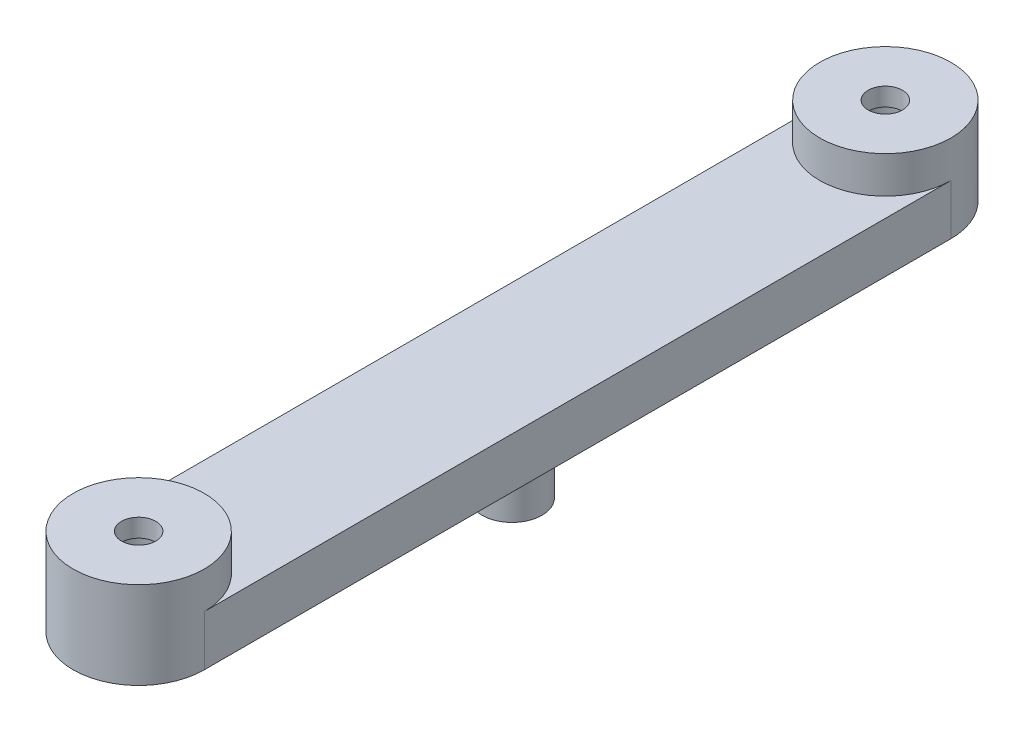
ISO-10303-21;
HEADER;
FILE_DESCRIPTION(('STEP AP214'),'2;1');
FILE_NAME('part.step','',(''),(''),'','','');
FILE_SCHEMA(('AUTOMOTIVE_DESIGN { 1 0 10303 214 1 1 1 1 }'));
ENDSEC;
DATA;
#1=APPLICATION_CONTEXT('core data for automotive mechanical design processes');
#2=APPLICATION_PROTOCOL_DEFINITION('international standard','automotive_design',2000,#1);
#3=PRODUCT_CONTEXT('',#1,'mechanical');
#4=PRODUCT('Part','Part','',(#3));
#5=PRODUCT_RELATED_PRODUCT_CATEGORY('part','',(#4));
#6=PRODUCT_DEFINITION_FORMATION('','',#4);
#7=PRODUCT_DEFINITION_CONTEXT('part definition',#1,'design');
#8=PRODUCT_DEFINITION('design','',#6,#7);
#9=PRODUCT_DEFINITION_SHAPE('','',#8);
#10=(LENGTH_UNIT() NAMED_UNIT(*) SI_UNIT(.MILLI.,.METRE.));
#11=(NAMED_UNIT(*) PLANE_ANGLE_UNIT() SI_UNIT($,.RADIAN.));
#12=(NAMED_UNIT(*) SI_UNIT($,.STERADIAN.) SOLID_ANGLE_UNIT());
#13=UNCERTAINTY_MEASURE_WITH_UNIT(LENGTH_MEASURE(1.E-05),#10,'distance_accuracy_value','');
#14=(GEOMETRIC_REPRESENTATION_CONTEXT(3) GLOBAL_UNCERTAINTY_ASSIGNED_CONTEXT((#13)) GLOBAL_UNIT_ASSIGNED_CONTEXT((#10,
#11,#12)) REPRESENTATION_CONTEXT('',''));
#15=CARTESIAN_POINT('',(0.,0.,0.));
#16=DIRECTION('',(0.,0.,1.));
#17=DIRECTION('',(1.,0.,0.));
#18=AXIS2_PLACEMENT_3D('',#15,#16,#17);
#19=CARTESIAN_POINT('',(6.5,-39.75,207.));
#20=DIRECTION('',(-1.,0.,0.));
#21=DIRECTION('',(0.,0.,1.));
#22=AXIS2_PLACEMENT_3D('',#19,#20,#21);
#23=PLANE('',#22);
#24=DIRECTION('',(0.,0.,-1.));
#25=VECTOR('',#24,1.);
#26=CARTESIAN_POINT('',(6.5,-44.75,207.));
#27=LINE('',#26,#25);
#28=CARTESIAN_POINT('',(6.5,-44.75,207.));
#29=VERTEX_POINT('',#28);
#30=CARTESIAN_POINT('',(6.5,-44.75,133.));
#31=VERTEX_POINT('',#30);
#32=EDGE_CURVE('E90',#29,#31,#27,.T.);
#33=ORIENTED_EDGE('',*,*,#32,.T.);
#34=DIRECTION('',(0.,-1.,0.));
#35=VECTOR('',#34,1.);
#36=CARTESIAN_POINT('',(6.5,-39.75,133.));
#37=LINE('',#36,#35);
#38=CARTESIAN_POINT('',(6.5,-39.75,133.));
#39=VERTEX_POINT('',#38);
#40=EDGE_CURVE('E11',#39,#31,#37,.T.);
#41=ORIENTED_EDGE('',*,*,#40,.F.);
#42=DIRECTION('',(0.,0.,-1.));
#43=VECTOR('',#42,1.);
#44=CARTESIAN_POINT('',(6.5,-39.75,207.));
#45=LINE('',#44,#43);
#46=CARTESIAN_POINT('',(6.5,-39.75,207.));
#47=VERTEX_POINT('',#46);
#48=EDGE_CURVE('E88',#47,#39,#45,.T.);
#49=ORIENTED_EDGE('',*,*,#48,.F.);
#50=DIRECTION('',(0.,-1.,0.));
#51=VECTOR('',#50,1.);
#52=CARTESIAN_POINT('',(6.5,-39.75,207.));
#53=LINE('',#52,#51);
#54=EDGE_CURVE('E83',#47,#29,#53,.T.);
#55=ORIENTED_EDGE('',*,*,#54,.T.);
#56=EDGE_LOOP('',(#33,#41,#49,#55));
#57=FACE_BOUND('',#56,.T.);
#58=ADVANCED_FACE('F43',(#57),#23,.F.);
#59=CARTESIAN_POINT('',(-6.5,-39.75,207.));
#60=DIRECTION('',(1.,0.,0.));
#61=DIRECTION('',(0.,0.,-1.));
#62=AXIS2_PLACEMENT_3D('',#59,#60,#61);
#63=PLANE('',#62);
#64=DIRECTION('',(0.,0.,1.));
#65=VECTOR('',#64,1.);
#66=CARTESIAN_POINT('',(-6.5,-44.75,207.));
#67=LINE('',#66,#65);
#68=CARTESIAN_POINT('',(-6.5,-44.75,133.));
#69=VERTEX_POINT('',#68);
#70=CARTESIAN_POINT('',(-6.5,-44.75,207.));
#71=VERTEX_POINT('',#70);
#72=EDGE_CURVE('E79',#69,#71,#67,.T.);
#73=ORIENTED_EDGE('',*,*,#72,.T.);
#74=DIRECTION('',(0.,-1.,0.));
#75=VECTOR('',#74,1.);
#76=CARTESIAN_POINT('',(-6.5,-39.75,207.));
#77=LINE('',#76,#75);
#78=CARTESIAN_POINT('',(-6.5,-39.75,207.));
#79=VERTEX_POINT('',#78);
#80=EDGE_CURVE('E95',#79,#71,#77,.T.);
#81=ORIENTED_EDGE('',*,*,#80,.F.);
#82=DIRECTION('',(0.,0.,1.));
#83=VECTOR('',#82,1.);
#84=CARTESIAN_POINT('',(-6.5,-39.75,207.));
#85=LINE('',#84,#83);
#86=CARTESIAN_POINT('',(-6.5,-39.75,133.));
#87=VERTEX_POINT('',#86);
#88=EDGE_CURVE('E93',#87,#79,#85,.T.);
#89=ORIENTED_EDGE('',*,*,#88,.F.);
#90=DIRECTION('',(0.,-1.,0.));
#91=VECTOR('',#90,1.);
#92=CARTESIAN_POINT('',(-6.5,-39.75,133.));
#93=LINE('',#92,#91);
#94=EDGE_CURVE('E52',#87,#69,#93,.T.);
#95=ORIENTED_EDGE('',*,*,#94,.T.);
#96=EDGE_LOOP('',(#73,#81,#89,#95));
#97=FACE_BOUND('',#96,.T.);
#98=ADVANCED_FACE('F190',(#97),#63,.F.);
#99=CARTESIAN_POINT('',(0.,-39.75,0.));
#100=DIRECTION('',(0.,-1.,0.));
#101=DIRECTION('',(0.,0.,-1.));
#102=AXIS2_PLACEMENT_3D('',#99,#100,#101);
#103=PLANE('',#102);
#104=CARTESIAN_POINT('',(0.,-39.75,133.));
#105=DIRECTION('',(0.,-1.,0.));
#106=DIRECTION('',(0.,0.,-1.));
#107=AXIS2_PLACEMENT_3D('',#104,#105,#106);
#108=CIRCLE('',#107,6.5);
#109=EDGE_CURVE('E101',#87,#39,#108,.F.);
#110=ORIENTED_EDGE('',*,*,#109,.F.);
#111=ORIENTED_EDGE('',*,*,#88,.T.);
#112=CARTESIAN_POINT('',(0.,-39.75,207.));
#113=DIRECTION('',(0.,-1.,0.));
#114=DIRECTION('',(0.,0.,-1.));
#115=AXIS2_PLACEMENT_3D('',#112,#113,#114);
#116=CIRCLE('',#115,6.5);
#117=EDGE_CURVE('E65',#47,#79,#116,.F.);
#118=ORIENTED_EDGE('',*,*,#117,.F.);
#119=ORIENTED_EDGE('',*,*,#48,.T.);
#120=EDGE_LOOP('',(#110,#111,#118,#119));
#121=FACE_BOUND('',#120,.T.);
#122=ADVANCED_FACE('F187',(#121),#103,.F.);
#123=CARTESIAN_POINT('',(0.,-44.75,0.));
#124=DIRECTION('',(0.,-1.,0.));
#125=DIRECTION('',(0.,0.,-1.));
#126=AXIS2_PLACEMENT_3D('',#123,#124,#125);
#127=PLANE('',#126);
#128=CARTESIAN_POINT('',(0.,-44.75,133.));
#129=DIRECTION('',(0.,1.,0.));
#130=DIRECTION('',(0.,0.,1.));
#131=AXIS2_PLACEMENT_3D('',#128,#129,#130);
#132=CIRCLE('',#131,3.);
#133=CARTESIAN_POINT('',(0.,-44.75,130.));
#134=VERTEX_POINT('',#133);
#135=EDGE_CURVE('E144',#134,#134,#132,.T.);
#136=ORIENTED_EDGE('',*,*,#135,.T.);
#137=EDGE_LOOP('',(#136));
#138=FACE_BOUND('',#137,.T.);
#139=CARTESIAN_POINT('',(0.,-44.75,207.));
#140=DIRECTION('',(0.,1.,0.));
#141=DIRECTION('',(0.,0.,1.));
#142=AXIS2_PLACEMENT_3D('',#139,#140,#141);
#143=CIRCLE('',#142,3.);
#144=CARTESIAN_POINT('',(0.,-44.75,204.));
#145=VERTEX_POINT('',#144);
#146=EDGE_CURVE('E149',#145,#145,#143,.T.);
#147=ORIENTED_EDGE('',*,*,#146,.T.);
#148=EDGE_LOOP('',(#147));
#149=FACE_BOUND('',#148,.T.);
#150=CARTESIAN_POINT('',(0.,-44.75,170.));
#151=DIRECTION('',(0.,1.,0.));
#152=DIRECTION('',(0.,0.,1.));
#153=AXIS2_PLACEMENT_3D('',#150,#151,#152);
#154=CIRCLE('',#153,2.975);
#155=CARTESIAN_POINT('',(0.,-44.75,172.975));
#156=VERTEX_POINT('',#155);
#157=EDGE_CURVE('E116',#156,#156,#154,.T.);
#158=ORIENTED_EDGE('',*,*,#157,.T.);
#159=EDGE_LOOP('',(#158));
#160=FACE_BOUND('',#159,.T.);
#161=ORIENTED_EDGE('',*,*,#72,.F.);
#162=CARTESIAN_POINT('',(0.,-44.75,133.));
#163=DIRECTION('',(0.,1.,0.));
#164=DIRECTION('',(0.,0.,1.));
#165=AXIS2_PLACEMENT_3D('',#162,#163,#164);
#166=CIRCLE('',#165,6.5);
#167=EDGE_CURVE('E103',#31,#69,#166,.T.);
#168=ORIENTED_EDGE('',*,*,#167,.F.);
#169=ORIENTED_EDGE('',*,*,#32,.F.);
#170=CARTESIAN_POINT('',(0.,-44.75,207.));
#171=DIRECTION('',(0.,1.,0.));
#172=DIRECTION('',(0.,0.,1.));
#173=AXIS2_PLACEMENT_3D('',#170,#171,#172);
#174=CIRCLE('',#173,6.5);
#175=EDGE_CURVE('E100',#71,#29,#174,.T.);
#176=ORIENTED_EDGE('',*,*,#175,.F.);
#177=EDGE_LOOP('',(#161,#168,#169,#176));
#178=FACE_BOUND('',#177,.T.);
#179=ADVANCED_FACE('F96',(#138,#149,#160,#178),#127,.T.);
#180=CARTESIAN_POINT('',(0.,-36.1,207.));
#181=DIRECTION('',(0.,-1.,0.));
#182=DIRECTION('',(0.,0.,-1.));
#183=AXIS2_PLACEMENT_3D('',#180,#181,#182);
#184=CYLINDRICAL_SURFACE('',#183,6.5);
#185=CARTESIAN_POINT('',(0.,-36.1,207.));
#186=DIRECTION('',(0.,1.,0.));
#187=DIRECTION('',(0.,0.,1.));
#188=AXIS2_PLACEMENT_3D('',#185,#186,#187);
#189=CIRCLE('',#188,6.5);
#190=CARTESIAN_POINT('',(0.,-36.1,213.5));
#191=VERTEX_POINT('',#190);
#192=EDGE_CURVE('E110',#191,#191,#189,.T.);
#193=ORIENTED_EDGE('',*,*,#192,.F.);
#194=EDGE_LOOP('',(#193));
#195=FACE_BOUND('',#194,.T.);
#196=ORIENTED_EDGE('',*,*,#175,.T.);
#197=ORIENTED_EDGE('',*,*,#54,.F.);
#198=ORIENTED_EDGE('',*,*,#117,.T.);
#199=ORIENTED_EDGE('',*,*,#80,.T.);
#200=EDGE_LOOP('',(#196,#197,#198,#199));
#201=FACE_BOUND('',#200,.T.);
#202=ADVANCED_FACE('F102',(#195,#201),#184,.T.);
#203=CARTESIAN_POINT('',(0.,-36.1,207.));
#204=DIRECTION('',(0.,1.,0.));
#205=DIRECTION('',(0.,0.,1.));
#206=AXIS2_PLACEMENT_3D('',#203,#204,#205);
#207=PLANE('',#206);
#208=CARTESIAN_POINT('',(0.,-36.1,207.));
#209=DIRECTION('',(0.,1.,0.));
#210=DIRECTION('',(0.,0.,1.));
#211=AXIS2_PLACEMENT_3D('',#208,#209,#210);
#212=CIRCLE('',#211,1.7);
#213=CARTESIAN_POINT('',(0.,-36.1,208.7));
#214=VERTEX_POINT('',#213);
#215=EDGE_CURVE('E142',#214,#214,#212,.T.);
#216=ORIENTED_EDGE('',*,*,#215,.F.);
#217=EDGE_LOOP('',(#216));
#218=FACE_BOUND('',#217,.T.);
#219=ORIENTED_EDGE('',*,*,#192,.T.);
#220=EDGE_LOOP('',(#219));
#221=FACE_BOUND('',#220,.T.);
#222=ADVANCED_FACE('F181',(#218,#221),#207,.T.);
#223=CARTESIAN_POINT('',(0.,-36.1,133.));
#224=DIRECTION('',(0.,-1.,0.));
#225=DIRECTION('',(0.,0.,-1.));
#226=AXIS2_PLACEMENT_3D('',#223,#224,#225);
#227=CYLINDRICAL_SURFACE('',#226,6.5);
#228=CARTESIAN_POINT('',(0.,-36.1,133.));
#229=DIRECTION('',(0.,1.,0.));
#230=DIRECTION('',(0.,0.,1.));
#231=AXIS2_PLACEMENT_3D('',#228,#229,#230);
#232=CIRCLE('',#231,6.5);
#233=CARTESIAN_POINT('',(0.,-36.1,139.5));
#234=VERTEX_POINT('',#233);
#235=EDGE_CURVE('E115',#234,#234,#232,.T.);
#236=ORIENTED_EDGE('',*,*,#235,.F.);
#237=EDGE_LOOP('',(#236));
#238=FACE_BOUND('',#237,.T.);
#239=ORIENTED_EDGE('',*,*,#109,.T.);
#240=ORIENTED_EDGE('',*,*,#40,.T.);
#241=ORIENTED_EDGE('',*,*,#167,.T.);
#242=ORIENTED_EDGE('',*,*,#94,.F.);
#243=EDGE_LOOP('',(#239,#240,#241,#242));
#244=FACE_BOUND('',#243,.T.);
#245=ADVANCED_FACE('F178',(#238,#244),#227,.T.);
#246=CARTESIAN_POINT('',(0.,-36.1,133.));
#247=DIRECTION('',(0.,1.,0.));
#248=DIRECTION('',(0.,0.,1.));
#249=AXIS2_PLACEMENT_3D('',#246,#247,#248);
#250=PLANE('',#249);
#251=CARTESIAN_POINT('',(0.,-36.1,133.));
#252=DIRECTION('',(0.,1.,0.));
#253=DIRECTION('',(0.,0.,1.));
#254=AXIS2_PLACEMENT_3D('',#251,#252,#253);
#255=CIRCLE('',#254,1.7);
#256=CARTESIAN_POINT('',(0.,-36.1,134.7));
#257=VERTEX_POINT('',#256);
#258=EDGE_CURVE('E159',#257,#257,#255,.T.);
#259=ORIENTED_EDGE('',*,*,#258,.F.);
#260=EDGE_LOOP('',(#259));
#261=FACE_BOUND('',#260,.T.);
#262=ORIENTED_EDGE('',*,*,#235,.T.);
#263=EDGE_LOOP('',(#262));
#264=FACE_BOUND('',#263,.T.);
#265=ADVANCED_FACE('F176',(#261,#264),#250,.T.);
#266=CARTESIAN_POINT('',(0.,-44.75,170.));
#267=DIRECTION('',(0.,-1.,0.));
#268=DIRECTION('',(0.,0.,-1.));
#269=AXIS2_PLACEMENT_3D('',#266,#267,#268);
#270=CYLINDRICAL_SURFACE('',#269,2.975);
#271=ORIENTED_EDGE('',*,*,#157,.F.);
#272=EDGE_LOOP('',(#271));
#273=FACE_BOUND('',#272,.T.);
#274=CARTESIAN_POINT('',(0.,-51.75,170.));
#275=DIRECTION('',(0.,1.,0.));
#276=DIRECTION('',(0.,0.,1.));
#277=AXIS2_PLACEMENT_3D('',#274,#275,#276);
#278=CIRCLE('',#277,2.975);
#279=CARTESIAN_POINT('',(0.,-51.75,172.975));
#280=VERTEX_POINT('',#279);
#281=EDGE_CURVE('E165',#280,#280,#278,.T.);
#282=ORIENTED_EDGE('',*,*,#281,.T.);
#283=EDGE_LOOP('',(#282));
#284=FACE_BOUND('',#283,.T.);
#285=ADVANCED_FACE('F207',(#273,#284),#270,.T.);
#286=CARTESIAN_POINT('',(0.,-51.75,170.));
#287=DIRECTION('',(0.,1.,0.));
#288=DIRECTION('',(0.,0.,1.));
#289=AXIS2_PLACEMENT_3D('',#286,#287,#288);
#290=PLANE('',#289);
#291=ORIENTED_EDGE('',*,*,#281,.F.);
#292=EDGE_LOOP('',(#291));
#293=FACE_BOUND('',#292,.T.);
#294=ADVANCED_FACE('F208',(#293),#290,.F.);
#295=CARTESIAN_POINT('',(0.,-36.1,133.));
#296=DIRECTION('',(0.,-1.,0.));
#297=DIRECTION('',(0.,0.,-1.));
#298=AXIS2_PLACEMENT_3D('',#295,#296,#297);
#299=CYLINDRICAL_SURFACE('',#298,1.7);
#300=CARTESIAN_POINT('',(0.,-37.9,133.));
#301=DIRECTION('',(0.,1.,0.));
#302=DIRECTION('',(0.,0.,1.));
#303=AXIS2_PLACEMENT_3D('',#300,#301,#302);
#304=CIRCLE('',#303,1.7);
#305=CARTESIAN_POINT('',(0.,-37.9,134.7));
#306=VERTEX_POINT('',#305);
#307=EDGE_CURVE('E46',#306,#306,#304,.T.);
#308=ORIENTED_EDGE('',*,*,#307,.F.);
#309=EDGE_LOOP('',(#308));
#310=FACE_BOUND('',#309,.T.);
#311=ORIENTED_EDGE('',*,*,#258,.T.);
#312=EDGE_LOOP('',(#311));
#313=FACE_BOUND('',#312,.T.);
#314=ADVANCED_FACE('F213',(#310,#313),#299,.F.);
#315=CARTESIAN_POINT('',(0.,-36.1,207.));
#316=DIRECTION('',(0.,-1.,0.));
#317=DIRECTION('',(0.,0.,-1.));
#318=AXIS2_PLACEMENT_3D('',#315,#316,#317);
#319=CYLINDRICAL_SURFACE('',#318,1.7);
#320=CARTESIAN_POINT('',(0.,-37.9,207.));
#321=DIRECTION('',(0.,1.,0.));
#322=DIRECTION('',(0.,0.,1.));
#323=AXIS2_PLACEMENT_3D('',#320,#321,#322);
#324=CIRCLE('',#323,1.7);
#325=CARTESIAN_POINT('',(0.,-37.9,208.7));
#326=VERTEX_POINT('',#325);
#327=EDGE_CURVE('E135',#326,#326,#324,.T.);
#328=ORIENTED_EDGE('',*,*,#327,.F.);
#329=EDGE_LOOP('',(#328));
#330=FACE_BOUND('',#329,.T.);
#331=ORIENTED_EDGE('',*,*,#215,.T.);
#332=EDGE_LOOP('',(#331));
#333=FACE_BOUND('',#332,.T.);
#334=ADVANCED_FACE('F217',(#330,#333),#319,.F.);
#335=CARTESIAN_POINT('',(0.,-37.9,207.));
#336=DIRECTION('',(0.,-1.,0.));
#337=DIRECTION('',(0.,0.,-1.));
#338=AXIS2_PLACEMENT_3D('',#335,#336,#337);
#339=CYLINDRICAL_SURFACE('',#338,3.);
#340=CARTESIAN_POINT('',(0.,-37.9,207.));
#341=DIRECTION('',(0.,1.,0.));
#342=DIRECTION('',(0.,0.,1.));
#343=AXIS2_PLACEMENT_3D('',#340,#341,#342);
#344=CIRCLE('',#343,3.);
#345=CARTESIAN_POINT('',(0.,-37.9,204.));
#346=VERTEX_POINT('',#345);
#347=EDGE_CURVE('E156',#346,#346,#344,.T.);
#348=CARTESIAN_POINT('',(0.,-37.9,204.));
#349=CARTESIAN_POINT('',(0.,-37.9713541666667,204.));
#350=CARTESIAN_POINT('',(0.,-38.0427083333333,204.));
#351=CARTESIAN_POINT('',(0.,-38.1854166666667,204.));
#352=CARTESIAN_POINT('',(0.,-38.2567708333333,204.));
#353=CARTESIAN_POINT('',(0.,-38.3994791666667,204.));
#354=CARTESIAN_POINT('',(0.,-38.4708333333333,204.));
#355=CARTESIAN_POINT('',(0.,-38.6135416666667,204.));
#356=CARTESIAN_POINT('',(0.,-38.6848958333333,204.));
#357=CARTESIAN_POINT('',(0.,-38.8276041666667,204.));
#358=CARTESIAN_POINT('',(0.,-38.8989583333333,204.));
#359=CARTESIAN_POINT('',(0.,-39.0416666666667,204.));
#360=CARTESIAN_POINT('',(0.,-39.1130208333333,204.));
#361=CARTESIAN_POINT('',(0.,-39.2557291666667,204.));
#362=CARTESIAN_POINT('',(0.,-39.3270833333333,204.));
#363=CARTESIAN_POINT('',(0.,-39.4697916666667,204.));
#364=CARTESIAN_POINT('',(0.,-39.5411458333333,204.));
#365=CARTESIAN_POINT('',(0.,-39.6838541666667,204.));
#366=CARTESIAN_POINT('',(0.,-39.7552083333333,204.));
#367=CARTESIAN_POINT('',(0.,-39.8979166666667,204.));
#368=CARTESIAN_POINT('',(0.,-39.9692708333333,204.));
#369=CARTESIAN_POINT('',(0.,-40.1119791666667,204.));
#370=CARTESIAN_POINT('',(0.,-40.1833333333333,204.));
#371=CARTESIAN_POINT('',(0.,-40.3260416666667,204.));
#372=CARTESIAN_POINT('',(0.,-40.3973958333333,204.));
#373=CARTESIAN_POINT('',(0.,-40.5401041666667,204.));
#374=CARTESIAN_POINT('',(0.,-40.6114583333333,204.));
#375=CARTESIAN_POINT('',(0.,-40.7541666666667,204.));
#376=CARTESIAN_POINT('',(0.,-40.8255208333333,204.));
#377=CARTESIAN_POINT('',(0.,-40.9682291666667,204.));
#378=CARTESIAN_POINT('',(0.,-41.0395833333333,204.));
#379=CARTESIAN_POINT('',(0.,-41.1822916666667,204.));
#380=CARTESIAN_POINT('',(0.,-41.2536458333333,204.));
#381=CARTESIAN_POINT('',(0.,-41.3963541666667,204.));
#382=CARTESIAN_POINT('',(0.,-41.4677083333333,204.));
#383=CARTESIAN_POINT('',(0.,-41.6104166666667,204.));
#384=CARTESIAN_POINT('',(0.,-41.6817708333333,204.));
#385=CARTESIAN_POINT('',(0.,-41.8244791666667,204.));
#386=CARTESIAN_POINT('',(0.,-41.8958333333333,204.));
#387=CARTESIAN_POINT('',(0.,-42.0385416666667,204.));
#388=CARTESIAN_POINT('',(0.,-42.1098958333333,204.));
#389=CARTESIAN_POINT('',(0.,-42.2526041666667,204.));
#390=CARTESIAN_POINT('',(0.,-42.3239583333333,204.));
#391=CARTESIAN_POINT('',(0.,-42.4666666666667,204.));
#392=CARTESIAN_POINT('',(0.,-42.5380208333333,204.));
#393=CARTESIAN_POINT('',(0.,-42.6807291666667,204.));
#394=CARTESIAN_POINT('',(0.,-42.7520833333333,204.));
#395=CARTESIAN_POINT('',(0.,-42.8947916666667,204.));
#396=CARTESIAN_POINT('',(0.,-42.9661458333333,204.));
#397=CARTESIAN_POINT('',(0.,-43.1088541666667,204.));
#398=CARTESIAN_POINT('',(0.,-43.1802083333333,204.));
#399=CARTESIAN_POINT('',(0.,-43.3229166666667,204.));
#400=CARTESIAN_POINT('',(0.,-43.3942708333333,204.));
#401=CARTESIAN_POINT('',(0.,-43.5369791666667,204.));
#402=CARTESIAN_POINT('',(0.,-43.6083333333333,204.));
#403=CARTESIAN_POINT('',(0.,-43.7510416666667,204.));
#404=CARTESIAN_POINT('',(0.,-43.8223958333333,204.));
#405=CARTESIAN_POINT('',(0.,-43.9651041666667,204.));
#406=CARTESIAN_POINT('',(0.,-44.0364583333333,204.));
#407=CARTESIAN_POINT('',(0.,-44.1791666666667,204.));
#408=CARTESIAN_POINT('',(0.,-44.2505208333333,204.));
#409=CARTESIAN_POINT('',(0.,-44.3932291666667,204.));
#410=CARTESIAN_POINT('',(0.,-44.4645833333333,204.));
#411=CARTESIAN_POINT('',(0.,-44.6072916666667,204.));
#412=CARTESIAN_POINT('',(0.,-44.6786458333333,204.));
#413=CARTESIAN_POINT('',(0.,-44.75,204.));
#414=B_SPLINE_CURVE_WITH_KNOTS('',3,(#348,#349,#350,#351,#352,#353,#354,#355,#356,#357,#358,
#359,#360,#361,#362,#363,#364,#365,#366,#367,#368,#369,#370,#371,#372,#373,#374,#375,#376,#377,
#378,#379,#380,#381,#382,#383,#384,#385,#386,#387,#388,#389,#390,#391,#392,#393,#394,#395,#396,
#397,#398,#399,#400,#401,#402,#403,#404,#405,#406,#407,#408,#409,#410,#411,#412,#413),
.UNSPECIFIED.,.F.,.F.,(4,2,2,2,2,2,2,2,2,2,2,2,2,2,2,2,2,2,2,2,2,2,2,2,2,2,2,2,2,2,2,2,4),(0.,
0.214062500000001,0.428125000000001,0.642187500000002,0.856250000000003,1.0703125,1.284375,
1.4984375,1.71250000000001,1.92656250000001,2.14062500000001,2.3546875,2.56875,2.7828125,
2.996875,3.2109375,3.425,3.6390625,3.85312500000001,4.06718750000001,4.28125000000001,
4.49531250000001,4.70937500000001,4.9234375,5.1375,5.3515625,5.565625,5.7796875,
5.99375000000001,6.20781250000001,6.42187500000001,6.63593750000001,6.85000000000001),.UNSPECIFIED.);
#415=EDGE_CURVE('BSEAM219',#346,#145,#414,.T.);
#416=ORIENTED_EDGE('',*,*,#347,.T.);
#417=ORIENTED_EDGE('',*,*,#146,.F.);
#418=ORIENTED_EDGE('',*,*,#415,.T.);
#419=ORIENTED_EDGE('',*,*,#415,.F.);
#420=EDGE_LOOP('',(#416,#418,#417,#419));
#421=FACE_BOUND('',#420,.T.);
#422=ADVANCED_FACE('F219',(#421),#339,.F.);
#423=CARTESIAN_POINT('',(0.,-37.9,207.));
#424=DIRECTION('',(0.,1.,0.));
#425=DIRECTION('',(0.,0.,1.));
#426=AXIS2_PLACEMENT_3D('',#423,#424,#425);
#427=PLANE('',#426);
#428=ORIENTED_EDGE('',*,*,#327,.T.);
#429=EDGE_LOOP('',(#428));
#430=FACE_BOUND('',#429,.T.);
#431=ORIENTED_EDGE('',*,*,#347,.F.);
#432=EDGE_LOOP('',(#431));
#433=FACE_BOUND('',#432,.T.);
#434=ADVANCED_FACE('F222',(#430,#433),#427,.F.);
#435=CARTESIAN_POINT('',(0.,-37.9,133.));
#436=DIRECTION('',(0.,-1.,0.));
#437=DIRECTION('',(0.,0.,-1.));
#438=AXIS2_PLACEMENT_3D('',#435,#436,#437);
#439=CYLINDRICAL_SURFACE('',#438,3.);
#440=CARTESIAN_POINT('',(0.,-37.9,133.));
#441=DIRECTION('',(0.,1.,0.));
#442=DIRECTION('',(0.,0.,1.));
#443=AXIS2_PLACEMENT_3D('',#440,#441,#442);
#444=CIRCLE('',#443,3.);
#445=CARTESIAN_POINT('',(0.,-37.9,130.));
#446=VERTEX_POINT('',#445);
#447=EDGE_CURVE('E131',#446,#446,#444,.T.);
#448=CARTESIAN_POINT('',(0.,-37.9,130.));
#449=CARTESIAN_POINT('',(0.,-37.9713541666667,130.));
#450=CARTESIAN_POINT('',(0.,-38.0427083333333,130.));
#451=CARTESIAN_POINT('',(0.,-38.1854166666667,130.));
#452=CARTESIAN_POINT('',(0.,-38.2567708333333,130.));
#453=CARTESIAN_POINT('',(0.,-38.3994791666667,130.));
#454=CARTESIAN_POINT('',(0.,-38.4708333333333,130.));
#455=CARTESIAN_POINT('',(0.,-38.6135416666667,130.));
#456=CARTESIAN_POINT('',(0.,-38.6848958333333,130.));
#457=CARTESIAN_POINT('',(0.,-38.8276041666667,130.));
#458=CARTESIAN_POINT('',(0.,-38.8989583333333,130.));
#459=CARTESIAN_POINT('',(0.,-39.0416666666667,130.));
#460=CARTESIAN_POINT('',(0.,-39.1130208333333,130.));
#461=CARTESIAN_POINT('',(0.,-39.2557291666667,130.));
#462=CARTESIAN_POINT('',(0.,-39.3270833333333,130.));
#463=CARTESIAN_POINT('',(0.,-39.4697916666667,130.));
#464=CARTESIAN_POINT('',(0.,-39.5411458333333,130.));
#465=CARTESIAN_POINT('',(0.,-39.6838541666667,130.));
#466=CARTESIAN_POINT('',(0.,-39.7552083333333,130.));
#467=CARTESIAN_POINT('',(0.,-39.8979166666667,130.));
#468=CARTESIAN_POINT('',(0.,-39.9692708333333,130.));
#469=CARTESIAN_POINT('',(0.,-40.1119791666667,130.));
#470=CARTESIAN_POINT('',(0.,-40.1833333333333,130.));
#471=CARTESIAN_POINT('',(0.,-40.3260416666667,130.));
#472=CARTESIAN_POINT('',(0.,-40.3973958333333,130.));
#473=CARTESIAN_POINT('',(0.,-40.5401041666667,130.));
#474=CARTESIAN_POINT('',(0.,-40.6114583333333,130.));
#475=CARTESIAN_POINT('',(0.,-40.7541666666667,130.));
#476=CARTESIAN_POINT('',(0.,-40.8255208333333,130.));
#477=CARTESIAN_POINT('',(0.,-40.9682291666667,130.));
#478=CARTESIAN_POINT('',(0.,-41.0395833333333,130.));
#479=CARTESIAN_POINT('',(0.,-41.1822916666667,130.));
#480=CARTESIAN_POINT('',(0.,-41.2536458333333,130.));
#481=CARTESIAN_POINT('',(0.,-41.3963541666667,130.));
#482=CARTESIAN_POINT('',(0.,-41.4677083333333,130.));
#483=CARTESIAN_POINT('',(0.,-41.6104166666667,130.));
#484=CARTESIAN_POINT('',(0.,-41.6817708333333,130.));
#485=CARTESIAN_POINT('',(0.,-41.8244791666667,130.));
#486=CARTESIAN_POINT('',(0.,-41.8958333333333,130.));
#487=CARTESIAN_POINT('',(0.,-42.0385416666667,130.));
#488=CARTESIAN_POINT('',(0.,-42.1098958333333,130.));
#489=CARTESIAN_POINT('',(0.,-42.2526041666667,130.));
#490=CARTESIAN_POINT('',(0.,-42.3239583333333,130.));
#491=CARTESIAN_POINT('',(0.,-42.4666666666667,130.));
#492=CARTESIAN_POINT('',(0.,-42.5380208333333,130.));
#493=CARTESIAN_POINT('',(0.,-42.6807291666667,130.));
#494=CARTESIAN_POINT('',(0.,-42.7520833333333,130.));
#495=CARTESIAN_POINT('',(0.,-42.8947916666667,130.));
#496=CARTESIAN_POINT('',(0.,-42.9661458333333,130.));
#497=CARTESIAN_POINT('',(0.,-43.1088541666667,130.));
#498=CARTESIAN_POINT('',(0.,-43.1802083333333,130.));
#499=CARTESIAN_POINT('',(0.,-43.3229166666667,130.));
#500=CARTESIAN_POINT('',(0.,-43.3942708333333,130.));
#501=CARTESIAN_POINT('',(0.,-43.5369791666667,130.));
#502=CARTESIAN_POINT('',(0.,-43.6083333333333,130.));
#503=CARTESIAN_POINT('',(0.,-43.7510416666667,130.));
#504=CARTESIAN_POINT('',(0.,-43.8223958333333,130.));
#505=CARTESIAN_POINT('',(0.,-43.9651041666667,130.));
#506=CARTESIAN_POINT('',(0.,-44.0364583333333,130.));
#507=CARTESIAN_POINT('',(0.,-44.1791666666667,130.));
#508=CARTESIAN_POINT('',(0.,-44.2505208333333,130.));
#509=CARTESIAN_POINT('',(0.,-44.3932291666667,130.));
#510=CARTESIAN_POINT('',(0.,-44.4645833333333,130.));
#511=CARTESIAN_POINT('',(0.,-44.6072916666667,130.));
#512=CARTESIAN_POINT('',(0.,-44.6786458333333,130.));
#513=CARTESIAN_POINT('',(0.,-44.75,130.));
#514=B_SPLINE_CURVE_WITH_KNOTS('',3,(#448,#449,#450,#451,#452,#453,#454,#455,#456,#457,#458,
#459,#460,#461,#462,#463,#464,#465,#466,#467,#468,#469,#470,#471,#472,#473,#474,#475,#476,#477,
#478,#479,#480,#481,#482,#483,#484,#485,#486,#487,#488,#489,#490,#491,#492,#493,#494,#495,#496,
#497,#498,#499,#500,#501,#502,#503,#504,#505,#506,#507,#508,#509,#510,#511,#512,#513),
.UNSPECIFIED.,.F.,.F.,(4,2,2,2,2,2,2,2,2,2,2,2,2,2,2,2,2,2,2,2,2,2,2,2,2,2,2,2,2,2,2,2,4),(0.,
0.214062500000001,0.428125000000001,0.642187500000002,0.856250000000003,1.0703125,1.284375,
1.4984375,1.71250000000001,1.92656250000001,2.14062500000001,2.3546875,2.56875,2.7828125,
2.996875,3.2109375,3.425,3.6390625,3.85312500000001,4.06718750000001,4.28125000000001,
4.49531250000001,4.70937500000001,4.9234375,5.1375,5.3515625,5.565625,5.7796875,
5.99375000000001,6.20781250000001,6.42187500000001,6.63593750000001,6.85000000000001),.UNSPECIFIED.);
#515=EDGE_CURVE('BSEAM227',#446,#134,#514,.T.);
#516=ORIENTED_EDGE('',*,*,#447,.T.);
#517=ORIENTED_EDGE('',*,*,#135,.F.);
#518=ORIENTED_EDGE('',*,*,#515,.T.);
#519=ORIENTED_EDGE('',*,*,#515,.F.);
#520=EDGE_LOOP('',(#516,#518,#517,#519));
#521=FACE_BOUND('',#520,.T.);
#522=ADVANCED_FACE('F227',(#521),#439,.F.);
#523=CARTESIAN_POINT('',(0.,-37.9,133.));
#524=DIRECTION('',(0.,1.,0.));
#525=DIRECTION('',(0.,0.,1.));
#526=AXIS2_PLACEMENT_3D('',#523,#524,#525);
#527=PLANE('',#526);
#528=ORIENTED_EDGE('',*,*,#307,.T.);
#529=EDGE_LOOP('',(#528));
#530=FACE_BOUND('',#529,.T.);
#531=ORIENTED_EDGE('',*,*,#447,.F.);
#532=EDGE_LOOP('',(#531));
#533=FACE_BOUND('',#532,.T.);
#534=ADVANCED_FACE('F231',(#530,#533),#527,.F.);
#535=CLOSED_SHELL('',(#58,#98,#122,#179,#202,#222,#245,#265,#285,#294,#314,#334,#422,#434,#522,#534));
#536=MANIFOLD_SOLID_BREP('B2',#535);
#537=ADVANCED_BREP_SHAPE_REPRESENTATION('',(#18,#536),#14);
#538=SHAPE_DEFINITION_REPRESENTATION(#9,#537);
ENDSEC;
END-ISO-10303-21;
